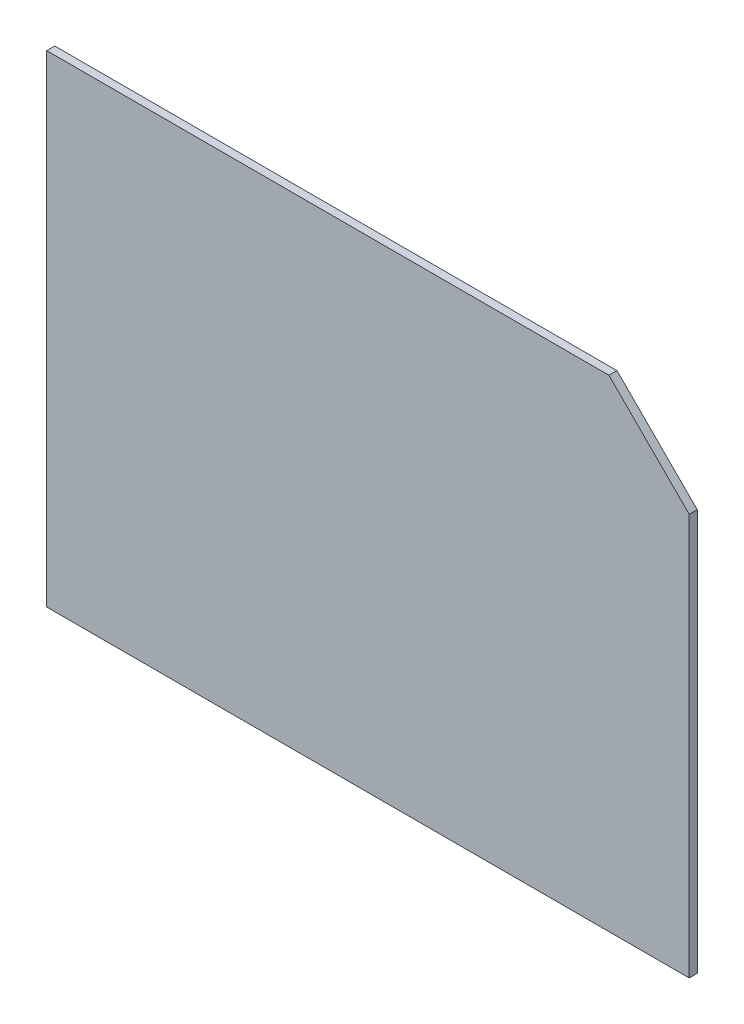
ISO-10303-21;
HEADER;
FILE_DESCRIPTION(('STEP AP214'),'2;1');
FILE_NAME('part.step','',(''),(''),'','','');
FILE_SCHEMA(('AUTOMOTIVE_DESIGN { 1 0 10303 214 1 1 1 1 }'));
ENDSEC;
DATA;
#1=APPLICATION_CONTEXT('core data for automotive mechanical design processes');
#2=APPLICATION_PROTOCOL_DEFINITION('international standard','automotive_design',2000,#1);
#3=PRODUCT_CONTEXT('',#1,'mechanical');
#4=PRODUCT('Part','Part','',(#3));
#5=PRODUCT_RELATED_PRODUCT_CATEGORY('part','',(#4));
#6=PRODUCT_DEFINITION_FORMATION('','',#4);
#7=PRODUCT_DEFINITION_CONTEXT('part definition',#1,'design');
#8=PRODUCT_DEFINITION('design','',#6,#7);
#9=PRODUCT_DEFINITION_SHAPE('','',#8);
#10=(LENGTH_UNIT() NAMED_UNIT(*) SI_UNIT(.MILLI.,.METRE.));
#11=(NAMED_UNIT(*) PLANE_ANGLE_UNIT() SI_UNIT($,.RADIAN.));
#12=(NAMED_UNIT(*) SI_UNIT($,.STERADIAN.) SOLID_ANGLE_UNIT());
#13=UNCERTAINTY_MEASURE_WITH_UNIT(LENGTH_MEASURE(1.E-05),#10,'distance_accuracy_value','');
#14=(GEOMETRIC_REPRESENTATION_CONTEXT(3) GLOBAL_UNCERTAINTY_ASSIGNED_CONTEXT((#13)) GLOBAL_UNIT_ASSIGNED_CONTEXT((#10,
#11,#12)) REPRESENTATION_CONTEXT('',''));
#15=CARTESIAN_POINT('',(0.,0.,0.));
#16=DIRECTION('',(0.,0.,1.));
#17=DIRECTION('',(1.,0.,0.));
#18=AXIS2_PLACEMENT_3D('',#15,#16,#17);
#19=CARTESIAN_POINT('',(-1000.,750.,-25.));
#20=DIRECTION('',(-1.,0.,0.));
#21=DIRECTION('',(0.,-1.,0.));
#22=AXIS2_PLACEMENT_3D('',#19,#20,#21);
#23=PLANE('',#22);
#24=DIRECTION('',(0.,-1.,0.));
#25=VECTOR('',#24,1.);
#26=CARTESIAN_POINT('',(-1000.,750.,0.));
#27=LINE('',#26,#25);
#28=CARTESIAN_POINT('',(-1000.,750.,0.));
#29=VERTEX_POINT('',#28);
#30=CARTESIAN_POINT('',(-1000.,-750.,0.));
#31=VERTEX_POINT('',#30);
#32=EDGE_CURVE('E111',#29,#31,#27,.T.);
#33=ORIENTED_EDGE('',*,*,#32,.F.);
#34=DIRECTION('',(0.,0.,1.));
#35=VECTOR('',#34,1.);
#36=CARTESIAN_POINT('',(-1000.,750.,-25.));
#37=LINE('',#36,#35);
#38=CARTESIAN_POINT('',(-1000.,750.,-25.));
#39=VERTEX_POINT('',#38);
#40=EDGE_CURVE('E11',#39,#29,#37,.T.);
#41=ORIENTED_EDGE('',*,*,#40,.F.);
#42=DIRECTION('',(0.,-1.,0.));
#43=VECTOR('',#42,1.);
#44=CARTESIAN_POINT('',(-1000.,750.,-25.));
#45=LINE('',#44,#43);
#46=CARTESIAN_POINT('',(-1000.,-750.,-25.));
#47=VERTEX_POINT('',#46);
#48=EDGE_CURVE('E109',#39,#47,#45,.T.);
#49=ORIENTED_EDGE('',*,*,#48,.T.);
#50=DIRECTION('',(0.,0.,1.));
#51=VECTOR('',#50,1.);
#52=CARTESIAN_POINT('',(-1000.,-750.,-25.));
#53=LINE('',#52,#51);
#54=EDGE_CURVE('E40',#47,#31,#53,.T.);
#55=ORIENTED_EDGE('',*,*,#54,.T.);
#56=EDGE_LOOP('',(#33,#41,#49,#55));
#57=FACE_BOUND('',#56,.T.);
#58=ADVANCED_FACE('F37',(#57),#23,.T.);
#59=CARTESIAN_POINT('',(-1000.,750.,-25.));
#60=DIRECTION('',(0.,1.,0.));
#61=DIRECTION('',(0.,0.,1.));
#62=AXIS2_PLACEMENT_3D('',#59,#60,#61);
#63=PLANE('',#62);
#64=DIRECTION('',(0.,0.,1.));
#65=VECTOR('',#64,1.);
#66=CARTESIAN_POINT('',(750.000000000003,750.,-932.));
#67=LINE('',#66,#65);
#68=CARTESIAN_POINT('',(750.000000000003,750.,-25.));
#69=VERTEX_POINT('',#68);
#70=CARTESIAN_POINT('',(750.000000000003,750.,0.));
#71=VERTEX_POINT('',#70);
#72=EDGE_CURVE('E53',#69,#71,#67,.T.);
#73=ORIENTED_EDGE('',*,*,#72,.F.);
#74=DIRECTION('',(-1.,0.,0.));
#75=VECTOR('',#74,1.);
#76=CARTESIAN_POINT('',(-1000.,750.,-25.));
#77=LINE('',#76,#75);
#78=EDGE_CURVE('E60',#69,#39,#77,.T.);
#79=ORIENTED_EDGE('',*,*,#78,.T.);
#80=ORIENTED_EDGE('',*,*,#40,.T.);
#81=DIRECTION('',(-1.,0.,0.));
#82=VECTOR('',#81,1.);
#83=CARTESIAN_POINT('',(-1000.,750.,0.));
#84=LINE('',#83,#82);
#85=EDGE_CURVE('E78',#71,#29,#84,.T.);
#86=ORIENTED_EDGE('',*,*,#85,.F.);
#87=EDGE_LOOP('',(#73,#79,#80,#86));
#88=FACE_BOUND('',#87,.T.);
#89=ADVANCED_FACE('F129',(#88),#63,.T.);
#90=CARTESIAN_POINT('',(1000.,750.,-25.));
#91=DIRECTION('',(1.,0.,0.));
#92=DIRECTION('',(0.,1.,0.));
#93=AXIS2_PLACEMENT_3D('',#90,#91,#92);
#94=PLANE('',#93);
#95=DIRECTION('',(0.,0.,1.));
#96=VECTOR('',#95,1.);
#97=CARTESIAN_POINT('',(1000.,500.,-932.));
#98=LINE('',#97,#96);
#99=CARTESIAN_POINT('',(1000.,500.,-25.));
#100=VERTEX_POINT('',#99);
#101=CARTESIAN_POINT('',(1000.,500.,0.));
#102=VERTEX_POINT('',#101);
#103=EDGE_CURVE('E93',#100,#102,#98,.T.);
#104=ORIENTED_EDGE('',*,*,#103,.T.);
#105=DIRECTION('',(0.,1.,0.));
#106=VECTOR('',#105,1.);
#107=CARTESIAN_POINT('',(1000.,750.,0.));
#108=LINE('',#107,#106);
#109=CARTESIAN_POINT('',(1000.,-750.,0.));
#110=VERTEX_POINT('',#109);
#111=EDGE_CURVE('E101',#110,#102,#108,.T.);
#112=ORIENTED_EDGE('',*,*,#111,.F.);
#113=DIRECTION('',(0.,0.,1.));
#114=VECTOR('',#113,1.);
#115=CARTESIAN_POINT('',(1000.,-750.,-25.));
#116=LINE('',#115,#114);
#117=CARTESIAN_POINT('',(1000.,-750.,-25.));
#118=VERTEX_POINT('',#117);
#119=EDGE_CURVE('E45',#118,#110,#116,.T.);
#120=ORIENTED_EDGE('',*,*,#119,.F.);
#121=DIRECTION('',(0.,1.,0.));
#122=VECTOR('',#121,1.);
#123=CARTESIAN_POINT('',(1000.,750.,-25.));
#124=LINE('',#123,#122);
#125=EDGE_CURVE('E104',#118,#100,#124,.T.);
#126=ORIENTED_EDGE('',*,*,#125,.T.);
#127=EDGE_LOOP('',(#104,#112,#120,#126));
#128=FACE_BOUND('',#127,.T.);
#129=ADVANCED_FACE('F100',(#128),#94,.T.);
#130=CARTESIAN_POINT('',(-1000.,-750.,-25.));
#131=DIRECTION('',(0.,-1.,0.));
#132=DIRECTION('',(0.,0.,-1.));
#133=AXIS2_PLACEMENT_3D('',#130,#131,#132);
#134=PLANE('',#133);
#135=DIRECTION('',(1.,0.,0.));
#136=VECTOR('',#135,1.);
#137=CARTESIAN_POINT('',(-1000.,-750.,0.));
#138=LINE('',#137,#136);
#139=EDGE_CURVE('E107',#31,#110,#138,.T.);
#140=ORIENTED_EDGE('',*,*,#139,.F.);
#141=ORIENTED_EDGE('',*,*,#54,.F.);
#142=DIRECTION('',(1.,0.,0.));
#143=VECTOR('',#142,1.);
#144=CARTESIAN_POINT('',(-1000.,-750.,-25.));
#145=LINE('',#144,#143);
#146=EDGE_CURVE('E118',#47,#118,#145,.T.);
#147=ORIENTED_EDGE('',*,*,#146,.T.);
#148=ORIENTED_EDGE('',*,*,#119,.T.);
#149=EDGE_LOOP('',(#140,#141,#147,#148));
#150=FACE_BOUND('',#149,.T.);
#151=ADVANCED_FACE('F126',(#150),#134,.T.);
#152=CARTESIAN_POINT('',(0.,0.,-25.));
#153=DIRECTION('',(0.,0.,1.));
#154=DIRECTION('',(1.,0.,0.));
#155=AXIS2_PLACEMENT_3D('',#152,#153,#154);
#156=PLANE('',#155);
#157=ORIENTED_EDGE('',*,*,#78,.F.);
#158=DIRECTION('',(0.707106781186544,-0.707106781186551,0.));
#159=VECTOR('',#158,1.);
#160=CARTESIAN_POINT('',(750.000000000005,749.999999999998,-25.));
#161=LINE('',#160,#159);
#162=EDGE_CURVE('E121',#69,#100,#161,.T.);
#163=ORIENTED_EDGE('',*,*,#162,.T.);
#164=ORIENTED_EDGE('',*,*,#125,.F.);
#165=ORIENTED_EDGE('',*,*,#146,.F.);
#166=ORIENTED_EDGE('',*,*,#48,.F.);
#167=EDGE_LOOP('',(#157,#163,#164,#165,#166));
#168=FACE_BOUND('',#167,.T.);
#169=ADVANCED_FACE('F128',(#168),#156,.F.);
#170=CARTESIAN_POINT('',(0.,0.,0.));
#171=DIRECTION('',(0.,0.,1.));
#172=DIRECTION('',(1.,0.,0.));
#173=AXIS2_PLACEMENT_3D('',#170,#171,#172);
#174=PLANE('',#173);
#175=DIRECTION('',(0.707106781186544,-0.707106781186551,0.));
#176=VECTOR('',#175,1.);
#177=CARTESIAN_POINT('',(750.000000000003,750.,0.));
#178=LINE('',#177,#176);
#179=EDGE_CURVE('E90',#71,#102,#178,.T.);
#180=ORIENTED_EDGE('',*,*,#179,.F.);
#181=ORIENTED_EDGE('',*,*,#85,.T.);
#182=ORIENTED_EDGE('',*,*,#32,.T.);
#183=ORIENTED_EDGE('',*,*,#139,.T.);
#184=ORIENTED_EDGE('',*,*,#111,.T.);
#185=EDGE_LOOP('',(#180,#181,#182,#183,#184));
#186=FACE_BOUND('',#185,.T.);
#187=ADVANCED_FACE('F106',(#186),#174,.T.);
#188=CARTESIAN_POINT('',(750.000000000003,750.,-932.));
#189=DIRECTION('',(-0.707106781186551,-0.707106781186544,0.));
#190=DIRECTION('',(0.707106781186544,-0.707106781186551,0.));
#191=AXIS2_PLACEMENT_3D('',#188,#189,#190);
#192=PLANE('',#191);
#193=ORIENTED_EDGE('',*,*,#72,.T.);
#194=ORIENTED_EDGE('',*,*,#179,.T.);
#195=ORIENTED_EDGE('',*,*,#103,.F.);
#196=ORIENTED_EDGE('',*,*,#162,.F.);
#197=EDGE_LOOP('',(#193,#194,#195,#196));
#198=FACE_BOUND('',#197,.T.);
#199=ADVANCED_FACE('F92',(#198),#192,.F.);
#200=CLOSED_SHELL('',(#58,#89,#129,#151,#169,#187,#199));
#201=MANIFOLD_SOLID_BREP('B2',#200);
#202=ADVANCED_BREP_SHAPE_REPRESENTATION('',(#18,#201),#14);
#203=SHAPE_DEFINITION_REPRESENTATION(#9,#202);
ENDSEC;
END-ISO-10303-21;
